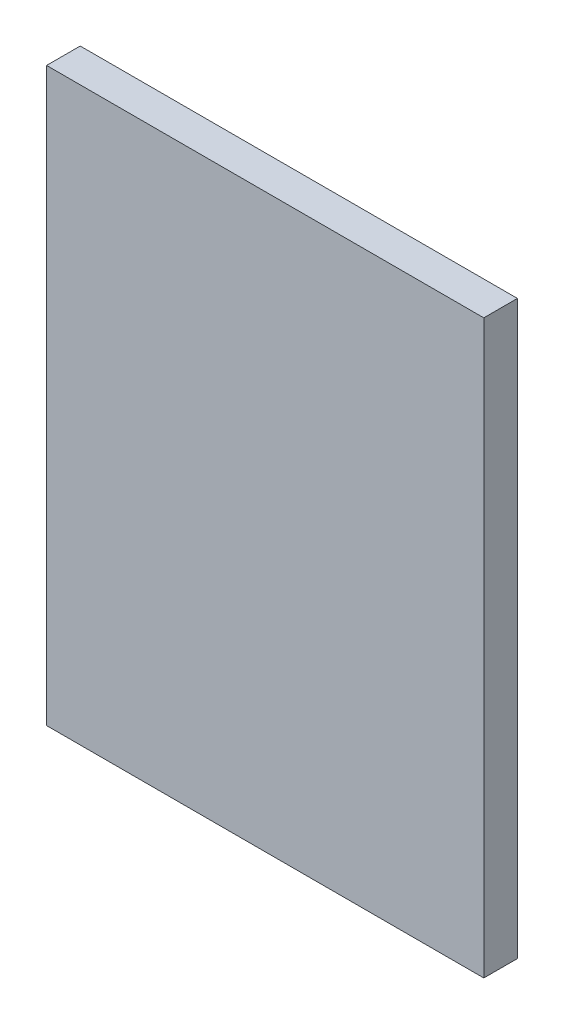
ISO-10303-21;
HEADER;
FILE_DESCRIPTION(('STEP AP214'),'2;1');
FILE_NAME('part.step','',(''),(''),'','','');
FILE_SCHEMA(('AUTOMOTIVE_DESIGN { 1 0 10303 214 1 1 1 1 }'));
ENDSEC;
DATA;
#1=APPLICATION_CONTEXT('core data for automotive mechanical design processes');
#2=APPLICATION_PROTOCOL_DEFINITION('international standard','automotive_design',2000,#1);
#3=PRODUCT_CONTEXT('',#1,'mechanical');
#4=PRODUCT('Part','Part','',(#3));
#5=PRODUCT_RELATED_PRODUCT_CATEGORY('part','',(#4));
#6=PRODUCT_DEFINITION_FORMATION('','',#4);
#7=PRODUCT_DEFINITION_CONTEXT('part definition',#1,'design');
#8=PRODUCT_DEFINITION('design','',#6,#7);
#9=PRODUCT_DEFINITION_SHAPE('','',#8);
#10=(LENGTH_UNIT() NAMED_UNIT(*) SI_UNIT(.MILLI.,.METRE.));
#11=(NAMED_UNIT(*) PLANE_ANGLE_UNIT() SI_UNIT($,.RADIAN.));
#12=(NAMED_UNIT(*) SI_UNIT($,.STERADIAN.) SOLID_ANGLE_UNIT());
#13=UNCERTAINTY_MEASURE_WITH_UNIT(LENGTH_MEASURE(1.E-05),#10,'distance_accuracy_value','');
#14=(GEOMETRIC_REPRESENTATION_CONTEXT(3) GLOBAL_UNCERTAINTY_ASSIGNED_CONTEXT((#13)) GLOBAL_UNIT_ASSIGNED_CONTEXT((#10,
#11,#12)) REPRESENTATION_CONTEXT('',''));
#15=CARTESIAN_POINT('',(0.,0.,0.));
#16=DIRECTION('',(0.,0.,1.));
#17=DIRECTION('',(1.,0.,0.));
#18=AXIS2_PLACEMENT_3D('',#15,#16,#17);
#19=CARTESIAN_POINT('',(-13.,-17.,2.));
#20=DIRECTION('',(1.,0.,0.));
#21=DIRECTION('',(0.,0.,-1.));
#22=AXIS2_PLACEMENT_3D('',#19,#20,#21);
#23=PLANE('',#22);
#24=DIRECTION('',(0.,-1.,0.));
#25=VECTOR('',#24,1.);
#26=CARTESIAN_POINT('',(-13.,-17.,0.));
#27=LINE('',#26,#25);
#28=CARTESIAN_POINT('',(-13.,17.,0.));
#29=VERTEX_POINT('',#28);
#30=CARTESIAN_POINT('',(-13.,-17.,0.));
#31=VERTEX_POINT('',#30);
#32=EDGE_CURVE('E100',#29,#31,#27,.T.);
#33=ORIENTED_EDGE('',*,*,#32,.T.);
#34=DIRECTION('',(0.,0.,-1.));
#35=VECTOR('',#34,1.);
#36=CARTESIAN_POINT('',(-13.,-17.,2.));
#37=LINE('',#36,#35);
#38=CARTESIAN_POINT('',(-13.,-17.,2.));
#39=VERTEX_POINT('',#38);
#40=EDGE_CURVE('E11',#39,#31,#37,.T.);
#41=ORIENTED_EDGE('',*,*,#40,.F.);
#42=DIRECTION('',(0.,-1.,0.));
#43=VECTOR('',#42,1.);
#44=CARTESIAN_POINT('',(-13.,-17.,2.));
#45=LINE('',#44,#43);
#46=CARTESIAN_POINT('',(-13.,17.,2.));
#47=VERTEX_POINT('',#46);
#48=EDGE_CURVE('E88',#47,#39,#45,.T.);
#49=ORIENTED_EDGE('',*,*,#48,.F.);
#50=DIRECTION('',(0.,0.,-1.));
#51=VECTOR('',#50,1.);
#52=CARTESIAN_POINT('',(-13.,17.,2.));
#53=LINE('',#52,#51);
#54=EDGE_CURVE('E96',#47,#29,#53,.T.);
#55=ORIENTED_EDGE('',*,*,#54,.T.);
#56=EDGE_LOOP('',(#33,#41,#49,#55));
#57=FACE_BOUND('',#56,.T.);
#58=ADVANCED_FACE('F37',(#57),#23,.F.);
#59=CARTESIAN_POINT('',(13.,-17.,2.));
#60=DIRECTION('',(0.,1.,0.));
#61=DIRECTION('',(-1.,0.,0.));
#62=AXIS2_PLACEMENT_3D('',#59,#60,#61);
#63=PLANE('',#62);
#64=DIRECTION('',(1.,0.,0.));
#65=VECTOR('',#64,1.);
#66=CARTESIAN_POINT('',(13.,-17.,0.));
#67=LINE('',#66,#65);
#68=CARTESIAN_POINT('',(13.,-17.,0.));
#69=VERTEX_POINT('',#68);
#70=EDGE_CURVE('E92',#31,#69,#67,.T.);
#71=ORIENTED_EDGE('',*,*,#70,.T.);
#72=DIRECTION('',(0.,0.,-1.));
#73=VECTOR('',#72,1.);
#74=CARTESIAN_POINT('',(13.,-17.,2.));
#75=LINE('',#74,#73);
#76=CARTESIAN_POINT('',(13.,-17.,2.));
#77=VERTEX_POINT('',#76);
#78=EDGE_CURVE('E45',#77,#69,#75,.T.);
#79=ORIENTED_EDGE('',*,*,#78,.F.);
#80=DIRECTION('',(1.,0.,0.));
#81=VECTOR('',#80,1.);
#82=CARTESIAN_POINT('',(13.,-17.,2.));
#83=LINE('',#82,#81);
#84=EDGE_CURVE('E83',#39,#77,#83,.T.);
#85=ORIENTED_EDGE('',*,*,#84,.F.);
#86=ORIENTED_EDGE('',*,*,#40,.T.);
#87=EDGE_LOOP('',(#71,#79,#85,#86));
#88=FACE_BOUND('',#87,.T.);
#89=ADVANCED_FACE('F91',(#88),#63,.F.);
#90=CARTESIAN_POINT('',(13.,-17.,2.));
#91=DIRECTION('',(-1.,0.,0.));
#92=DIRECTION('',(0.,0.,1.));
#93=AXIS2_PLACEMENT_3D('',#90,#91,#92);
#94=PLANE('',#93);
#95=DIRECTION('',(0.,1.,0.));
#96=VECTOR('',#95,1.);
#97=CARTESIAN_POINT('',(13.,-17.,0.));
#98=LINE('',#97,#96);
#99=CARTESIAN_POINT('',(13.,17.,0.));
#100=VERTEX_POINT('',#99);
#101=EDGE_CURVE('E70',#69,#100,#98,.T.);
#102=ORIENTED_EDGE('',*,*,#101,.T.);
#103=DIRECTION('',(0.,0.,-1.));
#104=VECTOR('',#103,1.);
#105=CARTESIAN_POINT('',(13.,17.,2.));
#106=LINE('',#105,#104);
#107=CARTESIAN_POINT('',(13.,17.,2.));
#108=VERTEX_POINT('',#107);
#109=EDGE_CURVE('E93',#108,#100,#106,.T.);
#110=ORIENTED_EDGE('',*,*,#109,.F.);
#111=DIRECTION('',(0.,1.,0.));
#112=VECTOR('',#111,1.);
#113=CARTESIAN_POINT('',(13.,-17.,2.));
#114=LINE('',#113,#112);
#115=EDGE_CURVE('E86',#77,#108,#114,.T.);
#116=ORIENTED_EDGE('',*,*,#115,.F.);
#117=ORIENTED_EDGE('',*,*,#78,.T.);
#118=EDGE_LOOP('',(#102,#110,#116,#117));
#119=FACE_BOUND('',#118,.T.);
#120=ADVANCED_FACE('F94',(#119),#94,.F.);
#121=CARTESIAN_POINT('',(13.,17.,2.));
#122=DIRECTION('',(0.,-1.,0.));
#123=DIRECTION('',(0.,0.,-1.));
#124=AXIS2_PLACEMENT_3D('',#121,#122,#123);
#125=PLANE('',#124);
#126=DIRECTION('',(-1.,0.,0.));
#127=VECTOR('',#126,1.);
#128=CARTESIAN_POINT('',(13.,17.,0.));
#129=LINE('',#128,#127);
#130=EDGE_CURVE('E76',#100,#29,#129,.T.);
#131=ORIENTED_EDGE('',*,*,#130,.T.);
#132=ORIENTED_EDGE('',*,*,#54,.F.);
#133=DIRECTION('',(-1.,0.,0.));
#134=VECTOR('',#133,1.);
#135=CARTESIAN_POINT('',(13.,17.,2.));
#136=LINE('',#135,#134);
#137=EDGE_CURVE('E53',#108,#47,#136,.T.);
#138=ORIENTED_EDGE('',*,*,#137,.F.);
#139=ORIENTED_EDGE('',*,*,#109,.T.);
#140=EDGE_LOOP('',(#131,#132,#138,#139));
#141=FACE_BOUND('',#140,.T.);
#142=ADVANCED_FACE('F107',(#141),#125,.F.);
#143=CARTESIAN_POINT('',(0.,0.,2.));
#144=DIRECTION('',(0.,0.,1.));
#145=DIRECTION('',(1.,0.,0.));
#146=AXIS2_PLACEMENT_3D('',#143,#144,#145);
#147=PLANE('',#146);
#148=ORIENTED_EDGE('',*,*,#48,.T.);
#149=ORIENTED_EDGE('',*,*,#84,.T.);
#150=ORIENTED_EDGE('',*,*,#115,.T.);
#151=ORIENTED_EDGE('',*,*,#137,.T.);
#152=EDGE_LOOP('',(#148,#149,#150,#151));
#153=FACE_BOUND('',#152,.T.);
#154=ADVANCED_FACE('F84',(#153),#147,.T.);
#155=CARTESIAN_POINT('',(0.,0.,0.));
#156=DIRECTION('',(0.,0.,1.));
#157=DIRECTION('',(1.,0.,0.));
#158=AXIS2_PLACEMENT_3D('',#155,#156,#157);
#159=PLANE('',#158);
#160=ORIENTED_EDGE('',*,*,#32,.F.);
#161=ORIENTED_EDGE('',*,*,#130,.F.);
#162=ORIENTED_EDGE('',*,*,#101,.F.);
#163=ORIENTED_EDGE('',*,*,#70,.F.);
#164=EDGE_LOOP('',(#160,#161,#162,#163));
#165=FACE_BOUND('',#164,.T.);
#166=ADVANCED_FACE('F110',(#165),#159,.F.);
#167=CLOSED_SHELL('',(#58,#89,#120,#142,#154,#166));
#168=MANIFOLD_SOLID_BREP('B2',#167);
#169=ADVANCED_BREP_SHAPE_REPRESENTATION('',(#18,#168),#14);
#170=SHAPE_DEFINITION_REPRESENTATION(#9,#169);
ENDSEC;
END-ISO-10303-21;
